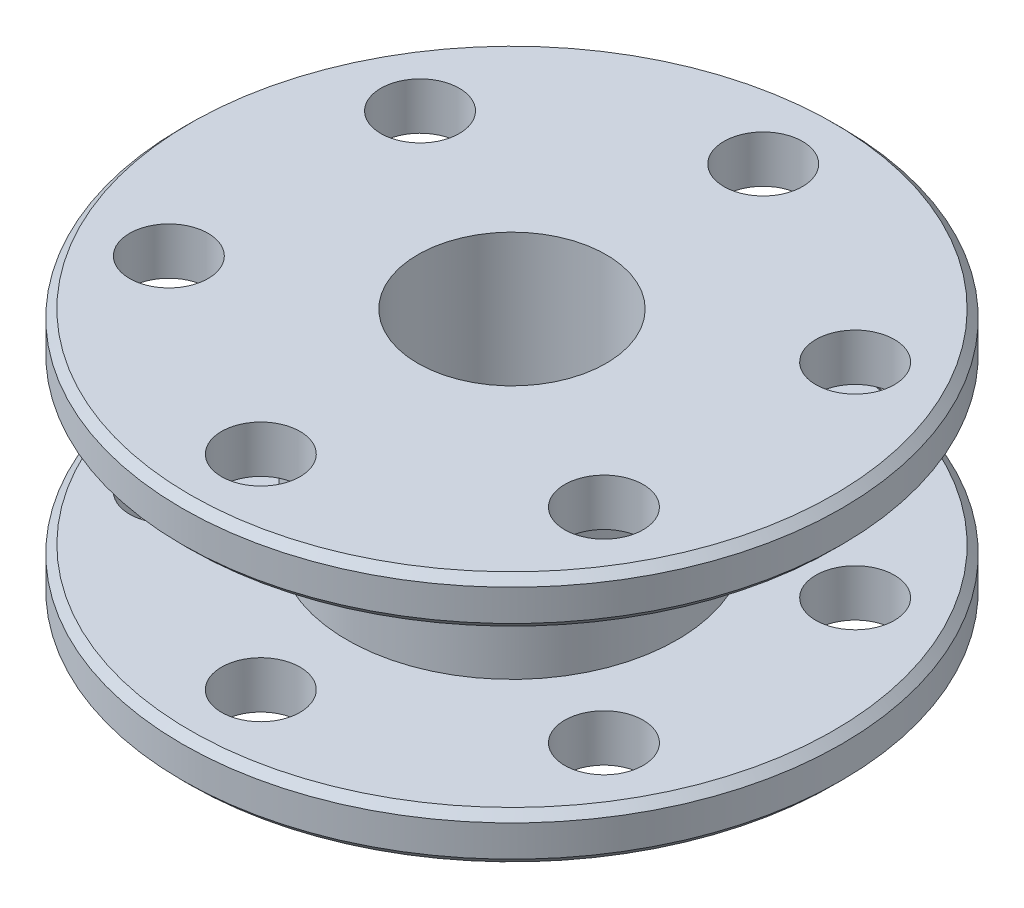
ISO-10303-21;
HEADER;
FILE_DESCRIPTION(('STEP AP214'),'2;1');
FILE_NAME('part.step','',(''),(''),'','','');
FILE_SCHEMA(('AUTOMOTIVE_DESIGN { 1 0 10303 214 1 1 1 1 }'));
ENDSEC;
DATA;
#1=APPLICATION_CONTEXT('core data for automotive mechanical design processes');
#2=APPLICATION_PROTOCOL_DEFINITION('international standard','automotive_design',2000,#1);
#3=PRODUCT_CONTEXT('',#1,'mechanical');
#4=PRODUCT('Part','Part','',(#3));
#5=PRODUCT_RELATED_PRODUCT_CATEGORY('part','',(#4));
#6=PRODUCT_DEFINITION_FORMATION('','',#4);
#7=PRODUCT_DEFINITION_CONTEXT('part definition',#1,'design');
#8=PRODUCT_DEFINITION('design','',#6,#7);
#9=PRODUCT_DEFINITION_SHAPE('','',#8);
#10=(LENGTH_UNIT() NAMED_UNIT(*) SI_UNIT(.MILLI.,.METRE.));
#11=(NAMED_UNIT(*) PLANE_ANGLE_UNIT() SI_UNIT($,.RADIAN.));
#12=(NAMED_UNIT(*) SI_UNIT($,.STERADIAN.) SOLID_ANGLE_UNIT());
#13=UNCERTAINTY_MEASURE_WITH_UNIT(LENGTH_MEASURE(1.E-05),#10,'distance_accuracy_value','');
#14=(GEOMETRIC_REPRESENTATION_CONTEXT(3) GLOBAL_UNCERTAINTY_ASSIGNED_CONTEXT((#13)) GLOBAL_UNIT_ASSIGNED_CONTEXT((#10,
#11,#12)) REPRESENTATION_CONTEXT('',''));
#15=CARTESIAN_POINT('',(0.,0.,0.));
#16=DIRECTION('',(0.,0.,1.));
#17=DIRECTION('',(1.,0.,0.));
#18=AXIS2_PLACEMENT_3D('',#15,#16,#17);
#19=CARTESIAN_POINT('',(0.,16.,0.));
#20=DIRECTION('',(0.,-1.,0.));
#21=DIRECTION('',(0.,0.,-1.));
#22=AXIS2_PLACEMENT_3D('',#19,#20,#21);
#23=CYLINDRICAL_SURFACE('',#22,21.);
#24=CARTESIAN_POINT('',(0.,0.5,0.));
#25=DIRECTION('',(0.,1.,0.));
#26=DIRECTION('',(0.,0.,1.));
#27=AXIS2_PLACEMENT_3D('',#24,#25,#26);
#28=CIRCLE('',#27,21.);
#29=CARTESIAN_POINT('',(0.,0.5,21.));
#30=VERTEX_POINT('',#29);
#31=EDGE_CURVE('E62',#30,#30,#28,.T.);
#32=ORIENTED_EDGE('',*,*,#31,.T.);
#33=EDGE_LOOP('',(#32));
#34=FACE_BOUND('',#33,.T.);
#35=CARTESIAN_POINT('',(0.,2.49999999999998,0.));
#36=DIRECTION('',(0.,-1.,0.));
#37=DIRECTION('',(0.,0.,-1.));
#38=AXIS2_PLACEMENT_3D('',#35,#36,#37);
#39=CIRCLE('',#38,21.);
#40=CARTESIAN_POINT('',(0.,2.49999999999998,-21.));
#41=VERTEX_POINT('',#40);
#42=EDGE_CURVE('E80',#41,#41,#39,.T.);
#43=ORIENTED_EDGE('',*,*,#42,.T.);
#44=EDGE_LOOP('',(#43));
#45=FACE_BOUND('',#44,.T.);
#46=ADVANCED_FACE('F43',(#34,#45),#23,.T.);
#47=CARTESIAN_POINT('',(0.,16.,-16.));
#48=DIRECTION('',(0.,-1.,0.));
#49=DIRECTION('',(0.,0.,-1.));
#50=AXIS2_PLACEMENT_3D('',#47,#48,#49);
#51=CYLINDRICAL_SURFACE('',#50,2.5);
#52=CARTESIAN_POINT('',(0.,3.,-16.));
#53=DIRECTION('',(0.,-1.,0.));
#54=DIRECTION('',(0.,0.,-1.));
#55=AXIS2_PLACEMENT_3D('',#52,#53,#54);
#56=CIRCLE('',#55,2.5);
#57=CARTESIAN_POINT('',(0.,3.,-18.5));
#58=VERTEX_POINT('',#57);
#59=EDGE_CURVE('E149',#58,#58,#56,.T.);
#60=ORIENTED_EDGE('',*,*,#59,.F.);
#61=EDGE_LOOP('',(#60));
#62=FACE_BOUND('',#61,.T.);
#63=CARTESIAN_POINT('',(0.,0.,-16.));
#64=DIRECTION('',(0.,1.,0.));
#65=DIRECTION('',(0.,0.,1.));
#66=AXIS2_PLACEMENT_3D('',#63,#64,#65);
#67=CIRCLE('',#66,2.5);
#68=CARTESIAN_POINT('',(0.,0.,-13.5));
#69=VERTEX_POINT('',#68);
#70=EDGE_CURVE('E105',#69,#69,#67,.T.);
#71=ORIENTED_EDGE('',*,*,#70,.F.);
#72=EDGE_LOOP('',(#71));
#73=FACE_BOUND('',#72,.T.);
#74=ADVANCED_FACE('F223',(#62,#73),#51,.F.);
#75=CARTESIAN_POINT('',(13.8564064605515,16.,-8.00000000000079));
#76=DIRECTION('',(0.,-1.,0.));
#77=DIRECTION('',(0.,0.,-1.));
#78=AXIS2_PLACEMENT_3D('',#75,#76,#77);
#79=CYLINDRICAL_SURFACE('',#78,2.50000000000024);
#80=CARTESIAN_POINT('',(13.8564064605515,3.,-8.00000000000079));
#81=DIRECTION('',(0.,-1.,0.));
#82=DIRECTION('',(0.,0.,-1.));
#83=AXIS2_PLACEMENT_3D('',#80,#81,#82);
#84=CIRCLE('',#83,2.50000000000024);
#85=CARTESIAN_POINT('',(13.8564064605515,3.,-10.500000000001));
#86=VERTEX_POINT('',#85);
#87=EDGE_CURVE('E156',#86,#86,#84,.T.);
#88=ORIENTED_EDGE('',*,*,#87,.F.);
#89=EDGE_LOOP('',(#88));
#90=FACE_BOUND('',#89,.T.);
#91=CARTESIAN_POINT('',(13.8564064605515,0.,-8.00000000000079));
#92=DIRECTION('',(0.,1.,0.));
#93=DIRECTION('',(0.,0.,1.));
#94=AXIS2_PLACEMENT_3D('',#91,#92,#93);
#95=CIRCLE('',#94,2.50000000000024);
#96=CARTESIAN_POINT('',(13.8564064605515,0.,-5.50000000000055));
#97=VERTEX_POINT('',#96);
#98=EDGE_CURVE('E113',#97,#97,#95,.T.);
#99=ORIENTED_EDGE('',*,*,#98,.F.);
#100=EDGE_LOOP('',(#99));
#101=FACE_BOUND('',#100,.T.);
#102=ADVANCED_FACE('F265',(#90,#101),#79,.F.);
#103=CARTESIAN_POINT('',(13.8564064605524,16.,7.99999999999921));
#104=DIRECTION('',(0.,-1.,0.));
#105=DIRECTION('',(0.,0.,-1.));
#106=AXIS2_PLACEMENT_3D('',#103,#104,#105);
#107=CYLINDRICAL_SURFACE('',#106,2.50000000000115);
#108=CARTESIAN_POINT('',(13.8564064605524,3.,7.99999999999921));
#109=DIRECTION('',(0.,-1.,0.));
#110=DIRECTION('',(0.,0.,-1.));
#111=AXIS2_PLACEMENT_3D('',#108,#109,#110);
#112=CIRCLE('',#111,2.50000000000115);
#113=CARTESIAN_POINT('',(13.8564064605524,3.,5.49999999999807));
#114=VERTEX_POINT('',#113);
#115=EDGE_CURVE('E160',#114,#114,#112,.T.);
#116=ORIENTED_EDGE('',*,*,#115,.F.);
#117=EDGE_LOOP('',(#116));
#118=FACE_BOUND('',#117,.T.);
#119=CARTESIAN_POINT('',(13.8564064605524,0.,7.99999999999921));
#120=DIRECTION('',(0.,1.,0.));
#121=DIRECTION('',(0.,0.,1.));
#122=AXIS2_PLACEMENT_3D('',#119,#120,#121);
#123=CIRCLE('',#122,2.50000000000115);
#124=CARTESIAN_POINT('',(13.8564064605524,0.,10.5000000000004));
#125=VERTEX_POINT('',#124);
#126=EDGE_CURVE('E121',#125,#125,#123,.T.);
#127=ORIENTED_EDGE('',*,*,#126,.F.);
#128=EDGE_LOOP('',(#127));
#129=FACE_BOUND('',#128,.T.);
#130=ADVANCED_FACE('F347',(#118,#129),#107,.F.);
#131=CARTESIAN_POINT('',(1.81311109890995E-12,16.,16.));
#132=DIRECTION('',(0.,-1.,0.));
#133=DIRECTION('',(0.,0.,-1.));
#134=AXIS2_PLACEMENT_3D('',#131,#132,#133);
#135=CYLINDRICAL_SURFACE('',#134,2.50000000000184);
#136=CARTESIAN_POINT('',(1.81311109890995E-12,3.,16.));
#137=DIRECTION('',(0.,-1.,0.));
#138=DIRECTION('',(0.,0.,-1.));
#139=AXIS2_PLACEMENT_3D('',#136,#137,#138);
#140=CIRCLE('',#139,2.50000000000184);
#141=CARTESIAN_POINT('',(1.81311109890995E-12,3.,13.4999999999982));
#142=VERTEX_POINT('',#141);
#143=EDGE_CURVE('E164',#142,#142,#140,.T.);
#144=ORIENTED_EDGE('',*,*,#143,.F.);
#145=EDGE_LOOP('',(#144));
#146=FACE_BOUND('',#145,.T.);
#147=CARTESIAN_POINT('',(1.81311109890995E-12,0.,16.));
#148=DIRECTION('',(0.,1.,0.));
#149=DIRECTION('',(0.,0.,1.));
#150=AXIS2_PLACEMENT_3D('',#147,#148,#149);
#151=CIRCLE('',#150,2.50000000000184);
#152=CARTESIAN_POINT('',(1.81311109890995E-12,0.,18.5000000000018));
#153=VERTEX_POINT('',#152);
#154=EDGE_CURVE('E129',#153,#153,#151,.T.);
#155=ORIENTED_EDGE('',*,*,#154,.F.);
#156=EDGE_LOOP('',(#155));
#157=FACE_BOUND('',#156,.T.);
#158=ADVANCED_FACE('F342',(#146,#157),#135,.F.);
#159=CARTESIAN_POINT('',(-13.8564064605497,16.,8.00000000000079));
#160=DIRECTION('',(0.,-1.,0.));
#161=DIRECTION('',(0.,0.,-1.));
#162=AXIS2_PLACEMENT_3D('',#159,#160,#161);
#163=CYLINDRICAL_SURFACE('',#162,2.50000000000168);
#164=CARTESIAN_POINT('',(-13.8564064605497,3.,8.00000000000079));
#165=DIRECTION('',(0.,-1.,0.));
#166=DIRECTION('',(0.,0.,-1.));
#167=AXIS2_PLACEMENT_3D('',#164,#165,#166);
#168=CIRCLE('',#167,2.50000000000168);
#169=CARTESIAN_POINT('',(-13.8564064605497,3.,5.49999999999911));
#170=VERTEX_POINT('',#169);
#171=EDGE_CURVE('E89',#170,#170,#168,.T.);
#172=ORIENTED_EDGE('',*,*,#171,.F.);
#173=EDGE_LOOP('',(#172));
#174=FACE_BOUND('',#173,.T.);
#175=CARTESIAN_POINT('',(-13.8564064605497,0.,8.00000000000079));
#176=DIRECTION('',(0.,1.,0.));
#177=DIRECTION('',(0.,0.,1.));
#178=AXIS2_PLACEMENT_3D('',#175,#176,#177);
#179=CIRCLE('',#178,2.50000000000168);
#180=CARTESIAN_POINT('',(-13.8564064605497,0.,10.5000000000025));
#181=VERTEX_POINT('',#180);
#182=EDGE_CURVE('E137',#181,#181,#179,.T.);
#183=ORIENTED_EDGE('',*,*,#182,.F.);
#184=EDGE_LOOP('',(#183));
#185=FACE_BOUND('',#184,.T.);
#186=ADVANCED_FACE('F254',(#174,#185),#163,.F.);
#187=CARTESIAN_POINT('',(-13.8564064605506,16.,-7.99999999999921));
#188=DIRECTION('',(0.,-1.,0.));
#189=DIRECTION('',(0.,0.,-1.));
#190=AXIS2_PLACEMENT_3D('',#187,#188,#189);
#191=CYLINDRICAL_SURFACE('',#190,2.50000000000085);
#192=CARTESIAN_POINT('',(-13.8564064605506,3.,-7.99999999999921));
#193=DIRECTION('',(0.,-1.,0.));
#194=DIRECTION('',(0.,0.,-1.));
#195=AXIS2_PLACEMENT_3D('',#192,#193,#194);
#196=CIRCLE('',#195,2.50000000000085);
#197=CARTESIAN_POINT('',(-13.8564064605506,3.,-10.5000000000001));
#198=VERTEX_POINT('',#197);
#199=EDGE_CURVE('E85',#198,#198,#196,.T.);
#200=ORIENTED_EDGE('',*,*,#199,.F.);
#201=EDGE_LOOP('',(#200));
#202=FACE_BOUND('',#201,.T.);
#203=CARTESIAN_POINT('',(-13.8564064605506,0.,-7.99999999999921));
#204=DIRECTION('',(0.,1.,0.));
#205=DIRECTION('',(0.,0.,1.));
#206=AXIS2_PLACEMENT_3D('',#203,#204,#205);
#207=CIRCLE('',#206,2.50000000000085);
#208=CARTESIAN_POINT('',(-13.8564064605506,0.,-5.49999999999836));
#209=VERTEX_POINT('',#208);
#210=EDGE_CURVE('E145',#209,#209,#207,.T.);
#211=ORIENTED_EDGE('',*,*,#210,.F.);
#212=EDGE_LOOP('',(#211));
#213=FACE_BOUND('',#212,.T.);
#214=ADVANCED_FACE('F230',(#202,#213),#191,.F.);
#215=CARTESIAN_POINT('',(0.,16.,0.));
#216=DIRECTION('',(0.,1.,0.));
#217=DIRECTION('',(0.,0.,1.));
#218=AXIS2_PLACEMENT_3D('',#215,#216,#217);
#219=PLANE('',#218);
#220=CARTESIAN_POINT('',(0.,16.,0.));
#221=DIRECTION('',(0.,1.,0.));
#222=DIRECTION('',(0.,0.,1.));
#223=AXIS2_PLACEMENT_3D('',#220,#221,#222);
#224=CIRCLE('',#223,20.5);
#225=CARTESIAN_POINT('',(0.,16.,20.5));
#226=VERTEX_POINT('',#225);
#227=EDGE_CURVE('E52',#226,#226,#224,.T.);
#228=ORIENTED_EDGE('',*,*,#227,.T.);
#229=EDGE_LOOP('',(#228));
#230=FACE_BOUND('',#229,.T.);
#231=CARTESIAN_POINT('',(-13.8564064605497,16.,8.00000000000079));
#232=DIRECTION('',(0.,1.,0.));
#233=DIRECTION('',(0.,0.,1.));
#234=AXIS2_PLACEMENT_3D('',#231,#232,#233);
#235=CIRCLE('',#234,2.50000000000168);
#236=CARTESIAN_POINT('',(-13.8564064605497,16.,10.5000000000025));
#237=VERTEX_POINT('',#236);
#238=EDGE_CURVE('E133',#237,#237,#235,.T.);
#239=ORIENTED_EDGE('',*,*,#238,.F.);
#240=EDGE_LOOP('',(#239));
#241=FACE_BOUND('',#240,.T.);
#242=CARTESIAN_POINT('',(13.8564064605524,16.,7.99999999999921));
#243=DIRECTION('',(0.,1.,0.));
#244=DIRECTION('',(0.,0.,1.));
#245=AXIS2_PLACEMENT_3D('',#242,#243,#244);
#246=CIRCLE('',#245,2.50000000000115);
#247=CARTESIAN_POINT('',(13.8564064605524,16.,10.5000000000004));
#248=VERTEX_POINT('',#247);
#249=EDGE_CURVE('E117',#248,#248,#246,.T.);
#250=ORIENTED_EDGE('',*,*,#249,.F.);
#251=EDGE_LOOP('',(#250));
#252=FACE_BOUND('',#251,.T.);
#253=CARTESIAN_POINT('',(0.,16.,-16.));
#254=DIRECTION('',(0.,1.,0.));
#255=DIRECTION('',(0.,0.,1.));
#256=AXIS2_PLACEMENT_3D('',#253,#254,#255);
#257=CIRCLE('',#256,2.5);
#258=CARTESIAN_POINT('',(0.,16.,-13.5));
#259=VERTEX_POINT('',#258);
#260=EDGE_CURVE('E101',#259,#259,#257,.T.);
#261=ORIENTED_EDGE('',*,*,#260,.F.);
#262=EDGE_LOOP('',(#261));
#263=FACE_BOUND('',#262,.T.);
#264=CARTESIAN_POINT('',(0.,16.,0.));
#265=DIRECTION('',(0.,1.,0.));
#266=DIRECTION('',(0.,0.,1.));
#267=AXIS2_PLACEMENT_3D('',#264,#265,#266);
#268=CIRCLE('',#267,6.);
#269=CARTESIAN_POINT('',(0.,16.,6.));
#270=VERTEX_POINT('',#269);
#271=EDGE_CURVE('E84',#270,#270,#268,.T.);
#272=ORIENTED_EDGE('',*,*,#271,.F.);
#273=EDGE_LOOP('',(#272));
#274=FACE_BOUND('',#273,.T.);
#275=CARTESIAN_POINT('',(13.8564064605515,16.,-8.00000000000079));
#276=DIRECTION('',(0.,1.,0.));
#277=DIRECTION('',(0.,0.,1.));
#278=AXIS2_PLACEMENT_3D('',#275,#276,#277);
#279=CIRCLE('',#278,2.50000000000024);
#280=CARTESIAN_POINT('',(13.8564064605515,16.,-5.50000000000055));
#281=VERTEX_POINT('',#280);
#282=EDGE_CURVE('E109',#281,#281,#279,.T.);
#283=ORIENTED_EDGE('',*,*,#282,.F.);
#284=EDGE_LOOP('',(#283));
#285=FACE_BOUND('',#284,.T.);
#286=CARTESIAN_POINT('',(1.81311109890995E-12,16.,16.));
#287=DIRECTION('',(0.,1.,0.));
#288=DIRECTION('',(0.,0.,1.));
#289=AXIS2_PLACEMENT_3D('',#286,#287,#288);
#290=CIRCLE('',#289,2.50000000000184);
#291=CARTESIAN_POINT('',(1.81311109890995E-12,16.,18.5000000000018));
#292=VERTEX_POINT('',#291);
#293=EDGE_CURVE('E125',#292,#292,#290,.T.);
#294=ORIENTED_EDGE('',*,*,#293,.F.);
#295=EDGE_LOOP('',(#294));
#296=FACE_BOUND('',#295,.T.);
#297=CARTESIAN_POINT('',(-13.8564064605506,16.,-7.99999999999921));
#298=DIRECTION('',(0.,1.,0.));
#299=DIRECTION('',(0.,0.,1.));
#300=AXIS2_PLACEMENT_3D('',#297,#298,#299);
#301=CIRCLE('',#300,2.50000000000085);
#302=CARTESIAN_POINT('',(-13.8564064605506,16.,-5.49999999999836));
#303=VERTEX_POINT('',#302);
#304=EDGE_CURVE('E141',#303,#303,#301,.T.);
#305=ORIENTED_EDGE('',*,*,#304,.F.);
#306=EDGE_LOOP('',(#305));
#307=FACE_BOUND('',#306,.T.);
#308=ADVANCED_FACE('F226',(#230,#241,#252,#263,#274,#285,#296,#307),#219,.T.);
#309=CARTESIAN_POINT('',(0.,0.,0.));
#310=DIRECTION('',(0.,1.,0.));
#311=DIRECTION('',(0.,0.,1.));
#312=AXIS2_PLACEMENT_3D('',#309,#310,#311);
#313=PLANE('',#312);
#314=CARTESIAN_POINT('',(0.,0.,0.));
#315=DIRECTION('',(0.,1.,0.));
#316=DIRECTION('',(0.,0.,1.));
#317=AXIS2_PLACEMENT_3D('',#314,#315,#316);
#318=CIRCLE('',#317,20.5);
#319=CARTESIAN_POINT('',(0.,0.,20.5));
#320=VERTEX_POINT('',#319);
#321=EDGE_CURVE('E57',#320,#320,#318,.F.);
#322=ORIENTED_EDGE('',*,*,#321,.T.);
#323=EDGE_LOOP('',(#322));
#324=FACE_BOUND('',#323,.T.);
#325=CARTESIAN_POINT('',(0.,0.,0.));
#326=DIRECTION('',(0.,1.,0.));
#327=DIRECTION('',(0.,0.,1.));
#328=AXIS2_PLACEMENT_3D('',#325,#326,#327);
#329=CIRCLE('',#328,6.);
#330=CARTESIAN_POINT('',(0.,0.,6.));
#331=VERTEX_POINT('',#330);
#332=EDGE_CURVE('E97',#331,#331,#329,.T.);
#333=ORIENTED_EDGE('',*,*,#332,.T.);
#334=EDGE_LOOP('',(#333));
#335=FACE_BOUND('',#334,.T.);
#336=ORIENTED_EDGE('',*,*,#70,.T.);
#337=EDGE_LOOP('',(#336));
#338=FACE_BOUND('',#337,.T.);
#339=ORIENTED_EDGE('',*,*,#98,.T.);
#340=EDGE_LOOP('',(#339));
#341=FACE_BOUND('',#340,.T.);
#342=ORIENTED_EDGE('',*,*,#126,.T.);
#343=EDGE_LOOP('',(#342));
#344=FACE_BOUND('',#343,.T.);
#345=ORIENTED_EDGE('',*,*,#154,.T.);
#346=EDGE_LOOP('',(#345));
#347=FACE_BOUND('',#346,.T.);
#348=ORIENTED_EDGE('',*,*,#182,.T.);
#349=EDGE_LOOP('',(#348));
#350=FACE_BOUND('',#349,.T.);
#351=ORIENTED_EDGE('',*,*,#210,.T.);
#352=EDGE_LOOP('',(#351));
#353=FACE_BOUND('',#352,.T.);
#354=ADVANCED_FACE('F229',(#324,#335,#338,#341,#344,#347,#350,#353),#313,.F.);
#355=CARTESIAN_POINT('',(0.,15.5,0.));
#356=DIRECTION('',(0.,1.,0.));
#357=DIRECTION('',(0.,0.,1.));
#358=AXIS2_PLACEMENT_3D('',#355,#356,#357);
#359=CIRCLE('',#358,21.);
#360=CARTESIAN_POINT('',(0.,15.5,21.));
#361=VERTEX_POINT('',#360);
#362=EDGE_CURVE('E10',#361,#361,#359,.F.);
#363=ORIENTED_EDGE('',*,*,#362,.T.);
#364=EDGE_LOOP('',(#363));
#365=FACE_BOUND('',#364,.T.);
#366=CARTESIAN_POINT('',(0.,13.5,0.));
#367=DIRECTION('',(0.,1.,0.));
#368=DIRECTION('',(0.,0.,1.));
#369=AXIS2_PLACEMENT_3D('',#366,#367,#368);
#370=CIRCLE('',#369,21.);
#371=CARTESIAN_POINT('',(0.,13.5,21.));
#372=VERTEX_POINT('',#371);
#373=EDGE_CURVE('E72',#372,#372,#370,.T.);
#374=ORIENTED_EDGE('',*,*,#373,.T.);
#375=EDGE_LOOP('',(#374));
#376=FACE_BOUND('',#375,.T.);
#377=ADVANCED_FACE('F261',(#365,#376),#23,.T.);
#378=CARTESIAN_POINT('',(0.,16.,0.));
#379=DIRECTION('',(0.,-1.,0.));
#380=DIRECTION('',(0.,0.,-1.));
#381=AXIS2_PLACEMENT_3D('',#378,#379,#380);
#382=CYLINDRICAL_SURFACE('',#381,6.);
#383=ORIENTED_EDGE('',*,*,#271,.T.);
#384=EDGE_LOOP('',(#383));
#385=FACE_BOUND('',#384,.T.);
#386=ORIENTED_EDGE('',*,*,#332,.F.);
#387=EDGE_LOOP('',(#386));
#388=FACE_BOUND('',#387,.T.);
#389=ADVANCED_FACE('F221',(#385,#388),#382,.F.);
#390=CARTESIAN_POINT('',(0.,13.,-16.));
#391=DIRECTION('',(0.,1.,0.));
#392=DIRECTION('',(0.,0.,1.));
#393=AXIS2_PLACEMENT_3D('',#390,#391,#392);
#394=CIRCLE('',#393,2.5);
#395=CARTESIAN_POINT('',(0.,13.,-13.5));
#396=VERTEX_POINT('',#395);
#397=EDGE_CURVE('E90',#396,#396,#394,.T.);
#398=ORIENTED_EDGE('',*,*,#397,.F.);
#399=EDGE_LOOP('',(#398));
#400=FACE_BOUND('',#399,.T.);
#401=ORIENTED_EDGE('',*,*,#260,.T.);
#402=EDGE_LOOP('',(#401));
#403=FACE_BOUND('',#402,.T.);
#404=ADVANCED_FACE('F217',(#400,#403),#51,.F.);
#405=CARTESIAN_POINT('',(13.8564064605515,13.,-8.00000000000079));
#406=DIRECTION('',(0.,1.,0.));
#407=DIRECTION('',(0.,0.,1.));
#408=AXIS2_PLACEMENT_3D('',#405,#406,#407);
#409=CIRCLE('',#408,2.50000000000024);
#410=CARTESIAN_POINT('',(13.8564064605515,13.,-5.50000000000055));
#411=VERTEX_POINT('',#410);
#412=EDGE_CURVE('E174',#411,#411,#409,.T.);
#413=ORIENTED_EDGE('',*,*,#412,.F.);
#414=EDGE_LOOP('',(#413));
#415=FACE_BOUND('',#414,.T.);
#416=ORIENTED_EDGE('',*,*,#282,.T.);
#417=EDGE_LOOP('',(#416));
#418=FACE_BOUND('',#417,.T.);
#419=ADVANCED_FACE('F220',(#415,#418),#79,.F.);
#420=CARTESIAN_POINT('',(13.8564064605524,13.,7.99999999999921));
#421=DIRECTION('',(0.,1.,0.));
#422=DIRECTION('',(0.,0.,1.));
#423=AXIS2_PLACEMENT_3D('',#420,#421,#422);
#424=CIRCLE('',#423,2.50000000000115);
#425=CARTESIAN_POINT('',(13.8564064605524,13.,10.5000000000004));
#426=VERTEX_POINT('',#425);
#427=EDGE_CURVE('E178',#426,#426,#424,.T.);
#428=ORIENTED_EDGE('',*,*,#427,.F.);
#429=EDGE_LOOP('',(#428));
#430=FACE_BOUND('',#429,.T.);
#431=ORIENTED_EDGE('',*,*,#249,.T.);
#432=EDGE_LOOP('',(#431));
#433=FACE_BOUND('',#432,.T.);
#434=ADVANCED_FACE('F352',(#430,#433),#107,.F.);
#435=CARTESIAN_POINT('',(1.81311109890995E-12,13.,16.));
#436=DIRECTION('',(0.,1.,0.));
#437=DIRECTION('',(0.,0.,1.));
#438=AXIS2_PLACEMENT_3D('',#435,#436,#437);
#439=CIRCLE('',#438,2.50000000000184);
#440=CARTESIAN_POINT('',(1.81311109890995E-12,13.,18.5000000000018));
#441=VERTEX_POINT('',#440);
#442=EDGE_CURVE('E182',#441,#441,#439,.T.);
#443=ORIENTED_EDGE('',*,*,#442,.F.);
#444=EDGE_LOOP('',(#443));
#445=FACE_BOUND('',#444,.T.);
#446=ORIENTED_EDGE('',*,*,#293,.T.);
#447=EDGE_LOOP('',(#446));
#448=FACE_BOUND('',#447,.T.);
#449=ADVANCED_FACE('F251',(#445,#448),#135,.F.);
#450=CARTESIAN_POINT('',(-13.8564064605497,13.,8.00000000000079));
#451=DIRECTION('',(0.,1.,0.));
#452=DIRECTION('',(0.,0.,1.));
#453=AXIS2_PLACEMENT_3D('',#450,#451,#452);
#454=CIRCLE('',#453,2.50000000000168);
#455=CARTESIAN_POINT('',(-13.8564064605497,13.,10.5000000000025));
#456=VERTEX_POINT('',#455);
#457=EDGE_CURVE('E95',#456,#456,#454,.T.);
#458=ORIENTED_EDGE('',*,*,#457,.F.);
#459=EDGE_LOOP('',(#458));
#460=FACE_BOUND('',#459,.T.);
#461=ORIENTED_EDGE('',*,*,#238,.T.);
#462=EDGE_LOOP('',(#461));
#463=FACE_BOUND('',#462,.T.);
#464=ADVANCED_FACE('F242',(#460,#463),#163,.F.);
#465=CARTESIAN_POINT('',(-13.8564064605506,13.,-7.99999999999921));
#466=DIRECTION('',(0.,1.,0.));
#467=DIRECTION('',(0.,0.,1.));
#468=AXIS2_PLACEMENT_3D('',#465,#466,#467);
#469=CIRCLE('',#468,2.50000000000085);
#470=CARTESIAN_POINT('',(-13.8564064605506,13.,-5.49999999999836));
#471=VERTEX_POINT('',#470);
#472=EDGE_CURVE('E91',#471,#471,#469,.T.);
#473=ORIENTED_EDGE('',*,*,#472,.F.);
#474=EDGE_LOOP('',(#473));
#475=FACE_BOUND('',#474,.T.);
#476=ORIENTED_EDGE('',*,*,#304,.T.);
#477=EDGE_LOOP('',(#476));
#478=FACE_BOUND('',#477,.T.);
#479=ADVANCED_FACE('F240',(#475,#478),#191,.F.);
#480=CARTESIAN_POINT('',(0.,3.,-10.5103799059678));
#481=DIRECTION('',(0.,-1.,0.));
#482=DIRECTION('',(0.,0.,-1.));
#483=AXIS2_PLACEMENT_3D('',#480,#481,#482);
#484=PLANE('',#483);
#485=CARTESIAN_POINT('',(0.,3.,0.));
#486=DIRECTION('',(0.,-1.,0.));
#487=DIRECTION('',(0.,0.,-1.));
#488=AXIS2_PLACEMENT_3D('',#485,#486,#487);
#489=CIRCLE('',#488,20.5);
#490=CARTESIAN_POINT('',(0.,3.,-20.5));
#491=VERTEX_POINT('',#490);
#492=EDGE_CURVE('E76',#491,#491,#489,.F.);
#493=ORIENTED_EDGE('',*,*,#492,.T.);
#494=EDGE_LOOP('',(#493));
#495=FACE_BOUND('',#494,.T.);
#496=CARTESIAN_POINT('',(0.,3.,0.));
#497=DIRECTION('',(0.,-1.,0.));
#498=DIRECTION('',(0.,0.,-1.));
#499=AXIS2_PLACEMENT_3D('',#496,#497,#498);
#500=CIRCLE('',#499,10.5103799059678);
#501=CARTESIAN_POINT('',(0.,3.,-10.5103799059678));
#502=VERTEX_POINT('',#501);
#503=EDGE_CURVE('E96',#502,#502,#500,.T.);
#504=ORIENTED_EDGE('',*,*,#503,.T.);
#505=EDGE_LOOP('',(#504));
#506=FACE_BOUND('',#505,.T.);
#507=ORIENTED_EDGE('',*,*,#199,.T.);
#508=EDGE_LOOP('',(#507));
#509=FACE_BOUND('',#508,.T.);
#510=ORIENTED_EDGE('',*,*,#171,.T.);
#511=EDGE_LOOP('',(#510));
#512=FACE_BOUND('',#511,.T.);
#513=ORIENTED_EDGE('',*,*,#143,.T.);
#514=EDGE_LOOP('',(#513));
#515=FACE_BOUND('',#514,.T.);
#516=ORIENTED_EDGE('',*,*,#115,.T.);
#517=EDGE_LOOP('',(#516));
#518=FACE_BOUND('',#517,.T.);
#519=ORIENTED_EDGE('',*,*,#87,.T.);
#520=EDGE_LOOP('',(#519));
#521=FACE_BOUND('',#520,.T.);
#522=ORIENTED_EDGE('',*,*,#59,.T.);
#523=EDGE_LOOP('',(#522));
#524=FACE_BOUND('',#523,.T.);
#525=ADVANCED_FACE('F202',(#495,#506,#509,#512,#515,#518,#521,#524),#484,.F.);
#526=CARTESIAN_POINT('',(0.,13.,-10.5103799059678));
#527=DIRECTION('',(0.,1.,0.));
#528=DIRECTION('',(0.,0.,1.));
#529=AXIS2_PLACEMENT_3D('',#526,#527,#528);
#530=PLANE('',#529);
#531=CARTESIAN_POINT('',(0.,13.,0.));
#532=DIRECTION('',(0.,1.,0.));
#533=DIRECTION('',(0.,0.,1.));
#534=AXIS2_PLACEMENT_3D('',#531,#532,#533);
#535=CIRCLE('',#534,20.5);
#536=CARTESIAN_POINT('',(0.,13.,20.5));
#537=VERTEX_POINT('',#536);
#538=EDGE_CURVE('E68',#537,#537,#535,.F.);
#539=ORIENTED_EDGE('',*,*,#538,.T.);
#540=EDGE_LOOP('',(#539));
#541=FACE_BOUND('',#540,.T.);
#542=CARTESIAN_POINT('',(0.,13.,0.));
#543=DIRECTION('',(0.,-1.,0.));
#544=DIRECTION('',(0.,0.,-1.));
#545=AXIS2_PLACEMENT_3D('',#542,#543,#544);
#546=CIRCLE('',#545,10.5103799059678);
#547=CARTESIAN_POINT('',(0.,13.,-10.5103799059678));
#548=VERTEX_POINT('',#547);
#549=EDGE_CURVE('E192',#548,#548,#546,.T.);
#550=ORIENTED_EDGE('',*,*,#549,.F.);
#551=EDGE_LOOP('',(#550));
#552=FACE_BOUND('',#551,.T.);
#553=ORIENTED_EDGE('',*,*,#472,.T.);
#554=EDGE_LOOP('',(#553));
#555=FACE_BOUND('',#554,.T.);
#556=ORIENTED_EDGE('',*,*,#457,.T.);
#557=EDGE_LOOP('',(#556));
#558=FACE_BOUND('',#557,.T.);
#559=ORIENTED_EDGE('',*,*,#442,.T.);
#560=EDGE_LOOP('',(#559));
#561=FACE_BOUND('',#560,.T.);
#562=ORIENTED_EDGE('',*,*,#427,.T.);
#563=EDGE_LOOP('',(#562));
#564=FACE_BOUND('',#563,.T.);
#565=ORIENTED_EDGE('',*,*,#412,.T.);
#566=EDGE_LOOP('',(#565));
#567=FACE_BOUND('',#566,.T.);
#568=ORIENTED_EDGE('',*,*,#397,.T.);
#569=EDGE_LOOP('',(#568));
#570=FACE_BOUND('',#569,.T.);
#571=ADVANCED_FACE('F199',(#541,#552,#555,#558,#561,#564,#567,#570),#530,.F.);
#572=CARTESIAN_POINT('',(0.,0.,0.));
#573=DIRECTION('',(0.,-1.,0.));
#574=DIRECTION('',(0.,0.,-1.));
#575=AXIS2_PLACEMENT_3D('',#572,#573,#574);
#576=CYLINDRICAL_SURFACE('',#575,10.5103799059678);
#577=ORIENTED_EDGE('',*,*,#503,.F.);
#578=EDGE_LOOP('',(#577));
#579=FACE_BOUND('',#578,.T.);
#580=ORIENTED_EDGE('',*,*,#549,.T.);
#581=EDGE_LOOP('',(#580));
#582=FACE_BOUND('',#581,.T.);
#583=ADVANCED_FACE('F197',(#579,#582),#576,.T.);
#584=CARTESIAN_POINT('',(0.,2.49999999999998,0.));
#585=DIRECTION('',(0.,-1.,0.));
#586=DIRECTION('',(0.,0.,-1.));
#587=AXIS2_PLACEMENT_3D('',#584,#585,#586);
#588=CONICAL_SURFACE('',#587,21.,0.785398163397448);
#589=ORIENTED_EDGE('',*,*,#492,.F.);
#590=EDGE_LOOP('',(#589));
#591=FACE_BOUND('',#590,.T.);
#592=ORIENTED_EDGE('',*,*,#42,.F.);
#593=EDGE_LOOP('',(#592));
#594=FACE_BOUND('',#593,.T.);
#595=ADVANCED_FACE('F284',(#591,#594),#588,.T.);
#596=CARTESIAN_POINT('',(0.,13.5,0.));
#597=DIRECTION('',(0.,1.,0.));
#598=DIRECTION('',(0.,0.,1.));
#599=AXIS2_PLACEMENT_3D('',#596,#597,#598);
#600=CONICAL_SURFACE('',#599,21.,0.785398163397448);
#601=ORIENTED_EDGE('',*,*,#538,.F.);
#602=EDGE_LOOP('',(#601));
#603=FACE_BOUND('',#602,.T.);
#604=ORIENTED_EDGE('',*,*,#373,.F.);
#605=EDGE_LOOP('',(#604));
#606=FACE_BOUND('',#605,.T.);
#607=ADVANCED_FACE('F281',(#603,#606),#600,.T.);
#608=CARTESIAN_POINT('',(0.,0.5,0.));
#609=DIRECTION('',(0.,1.,0.));
#610=DIRECTION('',(0.,0.,1.));
#611=AXIS2_PLACEMENT_3D('',#608,#609,#610);
#612=CONICAL_SURFACE('',#611,21.,0.785398163397448);
#613=ORIENTED_EDGE('',*,*,#321,.F.);
#614=EDGE_LOOP('',(#613));
#615=FACE_BOUND('',#614,.T.);
#616=ORIENTED_EDGE('',*,*,#31,.F.);
#617=EDGE_LOOP('',(#616));
#618=FACE_BOUND('',#617,.T.);
#619=ADVANCED_FACE('F283',(#615,#618),#612,.T.);
#620=CARTESIAN_POINT('',(0.,16.,0.));
#621=DIRECTION('',(0.,-1.,0.));
#622=DIRECTION('',(0.,0.,-1.));
#623=AXIS2_PLACEMENT_3D('',#620,#621,#622);
#624=CONICAL_SURFACE('',#623,20.5,0.785398163397438);
#625=ORIENTED_EDGE('',*,*,#362,.F.);
#626=EDGE_LOOP('',(#625));
#627=FACE_BOUND('',#626,.T.);
#628=ORIENTED_EDGE('',*,*,#227,.F.);
#629=EDGE_LOOP('',(#628));
#630=FACE_BOUND('',#629,.T.);
#631=ADVANCED_FACE('F46',(#627,#630),#624,.T.);
#632=CLOSED_SHELL('',(#46,#74,#102,#130,#158,#186,#214,#308,#354,#377,#389,#404,#419,#434,#449,
#464,#479,#525,#571,#583,#595,#607,#619,#631));
#633=MANIFOLD_SOLID_BREP('B2',#632);
#634=ADVANCED_BREP_SHAPE_REPRESENTATION('',(#18,#633),#14);
#635=SHAPE_DEFINITION_REPRESENTATION(#9,#634);
ENDSEC;
END-ISO-10303-21;
